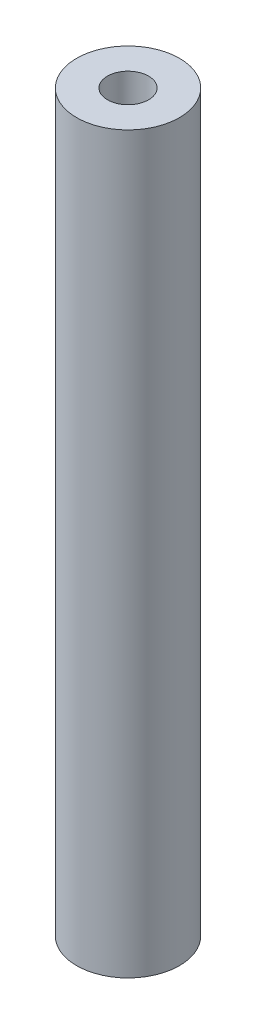
ISO-10303-21;
HEADER;
FILE_DESCRIPTION(('STEP AP214'),'2;1');
FILE_NAME('part.step','',(''),(''),'','','');
FILE_SCHEMA(('AUTOMOTIVE_DESIGN { 1 0 10303 214 1 1 1 1 }'));
ENDSEC;
DATA;
#1=APPLICATION_CONTEXT('core data for automotive mechanical design processes');
#2=APPLICATION_PROTOCOL_DEFINITION('international standard','automotive_design',2000,#1);
#3=PRODUCT_CONTEXT('',#1,'mechanical');
#4=PRODUCT('Part','Part','',(#3));
#5=PRODUCT_RELATED_PRODUCT_CATEGORY('part','',(#4));
#6=PRODUCT_DEFINITION_FORMATION('','',#4);
#7=PRODUCT_DEFINITION_CONTEXT('part definition',#1,'design');
#8=PRODUCT_DEFINITION('design','',#6,#7);
#9=PRODUCT_DEFINITION_SHAPE('','',#8);
#10=(LENGTH_UNIT() NAMED_UNIT(*) SI_UNIT(.MILLI.,.METRE.));
#11=(NAMED_UNIT(*) PLANE_ANGLE_UNIT() SI_UNIT($,.RADIAN.));
#12=(NAMED_UNIT(*) SI_UNIT($,.STERADIAN.) SOLID_ANGLE_UNIT());
#13=UNCERTAINTY_MEASURE_WITH_UNIT(LENGTH_MEASURE(1.E-05),#10,'distance_accuracy_value','');
#14=(GEOMETRIC_REPRESENTATION_CONTEXT(3) GLOBAL_UNCERTAINTY_ASSIGNED_CONTEXT((#13)) GLOBAL_UNIT_ASSIGNED_CONTEXT((#10,
#11,#12)) REPRESENTATION_CONTEXT('',''));
#15=CARTESIAN_POINT('',(0.,0.,0.));
#16=DIRECTION('',(0.,0.,1.));
#17=DIRECTION('',(1.,0.,0.));
#18=AXIS2_PLACEMENT_3D('',#15,#16,#17);
#19=CARTESIAN_POINT('',(0.,35.7,0.));
#20=DIRECTION('',(0.,1.,0.));
#21=DIRECTION('',(0.,0.,1.));
#22=AXIS2_PLACEMENT_3D('',#19,#20,#21);
#23=PLANE('',#22);
#24=CARTESIAN_POINT('',(0.,35.7,0.));
#25=DIRECTION('',(0.,1.,0.));
#26=DIRECTION('',(0.,0.,1.));
#27=AXIS2_PLACEMENT_3D('',#24,#25,#26);
#28=CIRCLE('',#27,2.5);
#29=CARTESIAN_POINT('',(0.,35.7,-2.5));
#30=VERTEX_POINT('',#29);
#31=EDGE_CURVE('E10',#30,#30,#28,.T.);
#32=ORIENTED_EDGE('',*,*,#31,.T.);
#33=EDGE_LOOP('',(#32));
#34=FACE_BOUND('',#33,.T.);
#35=CARTESIAN_POINT('',(0.,35.7,0.));
#36=DIRECTION('',(0.,1.,0.));
#37=DIRECTION('',(0.,0.,1.));
#38=AXIS2_PLACEMENT_3D('',#35,#36,#37);
#39=CIRCLE('',#38,1.);
#40=CARTESIAN_POINT('',(0.,35.7,-1.));
#41=VERTEX_POINT('',#40);
#42=EDGE_CURVE('E42',#41,#41,#39,.T.);
#43=ORIENTED_EDGE('',*,*,#42,.F.);
#44=EDGE_LOOP('',(#43));
#45=FACE_BOUND('',#44,.T.);
#46=ADVANCED_FACE('F31',(#34,#45),#23,.T.);
#47=CARTESIAN_POINT('',(0.,0.,0.));
#48=DIRECTION('',(0.,1.,0.));
#49=DIRECTION('',(0.,0.,1.));
#50=AXIS2_PLACEMENT_3D('',#47,#48,#49);
#51=PLANE('',#50);
#52=CARTESIAN_POINT('',(0.,0.,0.));
#53=DIRECTION('',(0.,1.,0.));
#54=DIRECTION('',(0.,0.,1.));
#55=AXIS2_PLACEMENT_3D('',#52,#53,#54);
#56=CIRCLE('',#55,2.5);
#57=CARTESIAN_POINT('',(0.,0.,-2.5));
#58=VERTEX_POINT('',#57);
#59=EDGE_CURVE('E35',#58,#58,#56,.T.);
#60=ORIENTED_EDGE('',*,*,#59,.F.);
#61=EDGE_LOOP('',(#60));
#62=FACE_BOUND('',#61,.T.);
#63=CARTESIAN_POINT('',(0.,0.,0.));
#64=DIRECTION('',(0.,1.,0.));
#65=DIRECTION('',(0.,0.,1.));
#66=AXIS2_PLACEMENT_3D('',#63,#64,#65);
#67=CIRCLE('',#66,1.);
#68=CARTESIAN_POINT('',(0.,0.,-1.));
#69=VERTEX_POINT('',#68);
#70=EDGE_CURVE('E44',#69,#69,#67,.T.);
#71=ORIENTED_EDGE('',*,*,#70,.T.);
#72=EDGE_LOOP('',(#71));
#73=FACE_BOUND('',#72,.T.);
#74=ADVANCED_FACE('F54',(#62,#73),#51,.F.);
#75=CARTESIAN_POINT('',(0.,35.7,0.));
#76=DIRECTION('',(0.,-1.,0.));
#77=DIRECTION('',(0.,0.,-1.));
#78=AXIS2_PLACEMENT_3D('',#75,#76,#77);
#79=CYLINDRICAL_SURFACE('',#78,2.5);
#80=CARTESIAN_POINT('',(0.,35.7,-2.5));
#81=CARTESIAN_POINT('',(0.,35.328125,-2.5));
#82=CARTESIAN_POINT('',(0.,34.95625,-2.5));
#83=CARTESIAN_POINT('',(0.,34.2125,-2.5));
#84=CARTESIAN_POINT('',(0.,33.840625,-2.5));
#85=CARTESIAN_POINT('',(0.,33.096875,-2.5));
#86=CARTESIAN_POINT('',(0.,32.725,-2.5));
#87=CARTESIAN_POINT('',(0.,31.98125,-2.5));
#88=CARTESIAN_POINT('',(0.,31.609375,-2.5));
#89=CARTESIAN_POINT('',(0.,30.865625,-2.5));
#90=CARTESIAN_POINT('',(0.,30.49375,-2.5));
#91=CARTESIAN_POINT('',(0.,29.75,-2.5));
#92=CARTESIAN_POINT('',(0.,29.378125,-2.5));
#93=CARTESIAN_POINT('',(0.,28.634375,-2.5));
#94=CARTESIAN_POINT('',(0.,28.2625,-2.5));
#95=CARTESIAN_POINT('',(0.,27.51875,-2.5));
#96=CARTESIAN_POINT('',(0.,27.146875,-2.5));
#97=CARTESIAN_POINT('',(0.,26.403125,-2.5));
#98=CARTESIAN_POINT('',(0.,26.03125,-2.5));
#99=CARTESIAN_POINT('',(0.,25.2875,-2.5));
#100=CARTESIAN_POINT('',(0.,24.915625,-2.5));
#101=CARTESIAN_POINT('',(0.,24.171875,-2.5));
#102=CARTESIAN_POINT('',(0.,23.8,-2.5));
#103=CARTESIAN_POINT('',(0.,23.05625,-2.5));
#104=CARTESIAN_POINT('',(0.,22.684375,-2.5));
#105=CARTESIAN_POINT('',(0.,21.940625,-2.5));
#106=CARTESIAN_POINT('',(0.,21.56875,-2.5));
#107=CARTESIAN_POINT('',(0.,20.825,-2.5));
#108=CARTESIAN_POINT('',(0.,20.453125,-2.5));
#109=CARTESIAN_POINT('',(0.,19.709375,-2.5));
#110=CARTESIAN_POINT('',(0.,19.3375,-2.5));
#111=CARTESIAN_POINT('',(0.,18.59375,-2.5));
#112=CARTESIAN_POINT('',(0.,18.221875,-2.5));
#113=CARTESIAN_POINT('',(0.,17.478125,-2.5));
#114=CARTESIAN_POINT('',(0.,17.10625,-2.5));
#115=CARTESIAN_POINT('',(0.,16.3625,-2.5));
#116=CARTESIAN_POINT('',(0.,15.990625,-2.5));
#117=CARTESIAN_POINT('',(0.,15.246875,-2.5));
#118=CARTESIAN_POINT('',(0.,14.875,-2.5));
#119=CARTESIAN_POINT('',(0.,14.13125,-2.5));
#120=CARTESIAN_POINT('',(0.,13.759375,-2.5));
#121=CARTESIAN_POINT('',(0.,13.015625,-2.5));
#122=CARTESIAN_POINT('',(0.,12.64375,-2.5));
#123=CARTESIAN_POINT('',(0.,11.9,-2.5));
#124=CARTESIAN_POINT('',(0.,11.528125,-2.5));
#125=CARTESIAN_POINT('',(0.,10.784375,-2.5));
#126=CARTESIAN_POINT('',(0.,10.4125,-2.5));
#127=CARTESIAN_POINT('',(0.,9.66875,-2.5));
#128=CARTESIAN_POINT('',(0.,9.296875,-2.5));
#129=CARTESIAN_POINT('',(0.,8.553125,-2.5));
#130=CARTESIAN_POINT('',(0.,8.18125,-2.5));
#131=CARTESIAN_POINT('',(0.,7.4375,-2.5));
#132=CARTESIAN_POINT('',(0.,7.065625,-2.5));
#133=CARTESIAN_POINT('',(0.,6.321875,-2.5));
#134=CARTESIAN_POINT('',(0.,5.95,-2.5));
#135=CARTESIAN_POINT('',(0.,5.20625,-2.5));
#136=CARTESIAN_POINT('',(0.,4.834375,-2.5));
#137=CARTESIAN_POINT('',(0.,4.090625,-2.5));
#138=CARTESIAN_POINT('',(0.,3.71875,-2.5));
#139=CARTESIAN_POINT('',(0.,2.975,-2.5));
#140=CARTESIAN_POINT('',(0.,2.603125,-2.5));
#141=CARTESIAN_POINT('',(0.,1.859375,-2.5));
#142=CARTESIAN_POINT('',(0.,1.4875,-2.5));
#143=CARTESIAN_POINT('',(0.,0.743750000000001,-2.5));
#144=CARTESIAN_POINT('',(0.,0.371875000000001,-2.5));
#145=CARTESIAN_POINT('',(0.,0.,-2.5));
#146=B_SPLINE_CURVE_WITH_KNOTS('',3,(#80,#81,#82,#83,#84,#85,#86,#87,#88,#89,#90,#91,#92,#93,
#94,#95,#96,#97,#98,#99,#100,#101,#102,#103,#104,#105,#106,#107,#108,#109,#110,#111,#112,#113,
#114,#115,#116,#117,#118,#119,#120,#121,#122,#123,#124,#125,#126,#127,#128,#129,#130,#131,#132,
#133,#134,#135,#136,#137,#138,#139,#140,#141,#142,#143,#144,#145),.UNSPECIFIED.,.F.,.F.,(4,2,2,
2,2,2,2,2,2,2,2,2,2,2,2,2,2,2,2,2,2,2,2,2,2,2,2,2,2,2,2,2,4),(0.,1.115625,2.23125,3.346875,
4.46249999999999,5.578125,6.69375,7.809375,8.925,10.040625,11.15625,12.271875,13.3875,14.503125,
15.61875,16.734375,17.85,18.965625,20.08125,21.196875,22.3125,23.428125,24.54375,25.659375,
26.775,27.890625,29.00625,30.121875,31.2375,32.353125,33.46875,34.584375,35.7),.UNSPECIFIED.);
#147=EDGE_CURVE('BSEAM33',#30,#58,#146,.T.);
#148=ORIENTED_EDGE('',*,*,#31,.F.);
#149=ORIENTED_EDGE('',*,*,#59,.T.);
#150=ORIENTED_EDGE('',*,*,#147,.T.);
#151=ORIENTED_EDGE('',*,*,#147,.F.);
#152=EDGE_LOOP('',(#148,#150,#149,#151));
#153=FACE_BOUND('',#152,.T.);
#154=ADVANCED_FACE('F33',(#153),#79,.T.);
#155=CARTESIAN_POINT('',(0.,35.7,0.));
#156=DIRECTION('',(0.,-1.,0.));
#157=DIRECTION('',(0.,0.,-1.));
#158=AXIS2_PLACEMENT_3D('',#155,#156,#157);
#159=CYLINDRICAL_SURFACE('',#158,1.);
#160=CARTESIAN_POINT('',(0.,35.7,-1.));
#161=CARTESIAN_POINT('',(0.,35.328125,-1.));
#162=CARTESIAN_POINT('',(0.,34.95625,-1.));
#163=CARTESIAN_POINT('',(0.,34.2125,-1.));
#164=CARTESIAN_POINT('',(0.,33.840625,-1.));
#165=CARTESIAN_POINT('',(0.,33.096875,-1.));
#166=CARTESIAN_POINT('',(0.,32.725,-1.));
#167=CARTESIAN_POINT('',(0.,31.98125,-1.));
#168=CARTESIAN_POINT('',(0.,31.609375,-1.));
#169=CARTESIAN_POINT('',(0.,30.865625,-1.));
#170=CARTESIAN_POINT('',(0.,30.49375,-1.));
#171=CARTESIAN_POINT('',(0.,29.75,-1.));
#172=CARTESIAN_POINT('',(0.,29.378125,-1.));
#173=CARTESIAN_POINT('',(0.,28.634375,-1.));
#174=CARTESIAN_POINT('',(0.,28.2625,-1.));
#175=CARTESIAN_POINT('',(0.,27.51875,-1.));
#176=CARTESIAN_POINT('',(0.,27.146875,-1.));
#177=CARTESIAN_POINT('',(0.,26.403125,-1.));
#178=CARTESIAN_POINT('',(0.,26.03125,-1.));
#179=CARTESIAN_POINT('',(0.,25.2875,-1.));
#180=CARTESIAN_POINT('',(0.,24.915625,-1.));
#181=CARTESIAN_POINT('',(0.,24.171875,-1.));
#182=CARTESIAN_POINT('',(0.,23.8,-1.));
#183=CARTESIAN_POINT('',(0.,23.05625,-1.));
#184=CARTESIAN_POINT('',(0.,22.684375,-1.));
#185=CARTESIAN_POINT('',(0.,21.940625,-1.));
#186=CARTESIAN_POINT('',(0.,21.56875,-1.));
#187=CARTESIAN_POINT('',(0.,20.825,-1.));
#188=CARTESIAN_POINT('',(0.,20.453125,-1.));
#189=CARTESIAN_POINT('',(0.,19.709375,-1.));
#190=CARTESIAN_POINT('',(0.,19.3375,-1.));
#191=CARTESIAN_POINT('',(0.,18.59375,-1.));
#192=CARTESIAN_POINT('',(0.,18.221875,-1.));
#193=CARTESIAN_POINT('',(0.,17.478125,-1.));
#194=CARTESIAN_POINT('',(0.,17.10625,-1.));
#195=CARTESIAN_POINT('',(0.,16.3625,-1.));
#196=CARTESIAN_POINT('',(0.,15.990625,-1.));
#197=CARTESIAN_POINT('',(0.,15.246875,-1.));
#198=CARTESIAN_POINT('',(0.,14.875,-1.));
#199=CARTESIAN_POINT('',(0.,14.13125,-1.));
#200=CARTESIAN_POINT('',(0.,13.759375,-1.));
#201=CARTESIAN_POINT('',(0.,13.015625,-1.));
#202=CARTESIAN_POINT('',(0.,12.64375,-1.));
#203=CARTESIAN_POINT('',(0.,11.9,-1.));
#204=CARTESIAN_POINT('',(0.,11.528125,-1.));
#205=CARTESIAN_POINT('',(0.,10.784375,-1.));
#206=CARTESIAN_POINT('',(0.,10.4125,-1.));
#207=CARTESIAN_POINT('',(0.,9.66875,-1.));
#208=CARTESIAN_POINT('',(0.,9.296875,-1.));
#209=CARTESIAN_POINT('',(0.,8.55312499999999,-1.));
#210=CARTESIAN_POINT('',(0.,8.18124999999999,-1.));
#211=CARTESIAN_POINT('',(0.,7.43749999999999,-1.));
#212=CARTESIAN_POINT('',(0.,7.06562499999999,-1.));
#213=CARTESIAN_POINT('',(0.,6.321875,-1.));
#214=CARTESIAN_POINT('',(0.,5.95,-1.));
#215=CARTESIAN_POINT('',(0.,5.20625,-1.));
#216=CARTESIAN_POINT('',(0.,4.834375,-1.));
#217=CARTESIAN_POINT('',(0.,4.090625,-1.));
#218=CARTESIAN_POINT('',(0.,3.71875,-1.));
#219=CARTESIAN_POINT('',(0.,2.975,-1.));
#220=CARTESIAN_POINT('',(0.,2.603125,-1.));
#221=CARTESIAN_POINT('',(0.,1.859375,-1.));
#222=CARTESIAN_POINT('',(0.,1.4875,-1.));
#223=CARTESIAN_POINT('',(0.,0.743750000000002,-1.));
#224=CARTESIAN_POINT('',(0.,0.371875000000001,-1.));
#225=CARTESIAN_POINT('',(0.,0.,-1.));
#226=B_SPLINE_CURVE_WITH_KNOTS('',3,(#160,#161,#162,#163,#164,#165,#166,#167,#168,#169,#170,
#171,#172,#173,#174,#175,#176,#177,#178,#179,#180,#181,#182,#183,#184,#185,#186,#187,#188,#189,
#190,#191,#192,#193,#194,#195,#196,#197,#198,#199,#200,#201,#202,#203,#204,#205,#206,#207,#208,
#209,#210,#211,#212,#213,#214,#215,#216,#217,#218,#219,#220,#221,#222,#223,#224,#225),
.UNSPECIFIED.,.F.,.F.,(4,2,2,2,2,2,2,2,2,2,2,2,2,2,2,2,2,2,2,2,2,2,2,2,2,2,2,2,2,2,2,2,4),(0.,
1.115625,2.23125,3.34687500000001,4.4625,5.578125,6.69375,7.809375,8.925,10.040625,11.15625,
12.271875,13.3875,14.503125,15.61875,16.734375,17.85,18.965625,20.08125,21.196875,22.3125,
23.428125,24.54375,25.659375,26.775,27.890625,29.00625,30.121875,31.2375,32.353125,33.46875,
34.584375,35.7),.UNSPECIFIED.);
#227=EDGE_CURVE('BSEAM50',#41,#69,#226,.T.);
#228=ORIENTED_EDGE('',*,*,#42,.T.);
#229=ORIENTED_EDGE('',*,*,#70,.F.);
#230=ORIENTED_EDGE('',*,*,#227,.T.);
#231=ORIENTED_EDGE('',*,*,#227,.F.);
#232=EDGE_LOOP('',(#228,#230,#229,#231));
#233=FACE_BOUND('',#232,.T.);
#234=ADVANCED_FACE('F50',(#233),#159,.F.);
#235=CLOSED_SHELL('',(#46,#74,#154,#234));
#236=MANIFOLD_SOLID_BREP('B2',#235);
#237=ADVANCED_BREP_SHAPE_REPRESENTATION('',(#18,#236),#14);
#238=SHAPE_DEFINITION_REPRESENTATION(#9,#237);
ENDSEC;
END-ISO-10303-21;
